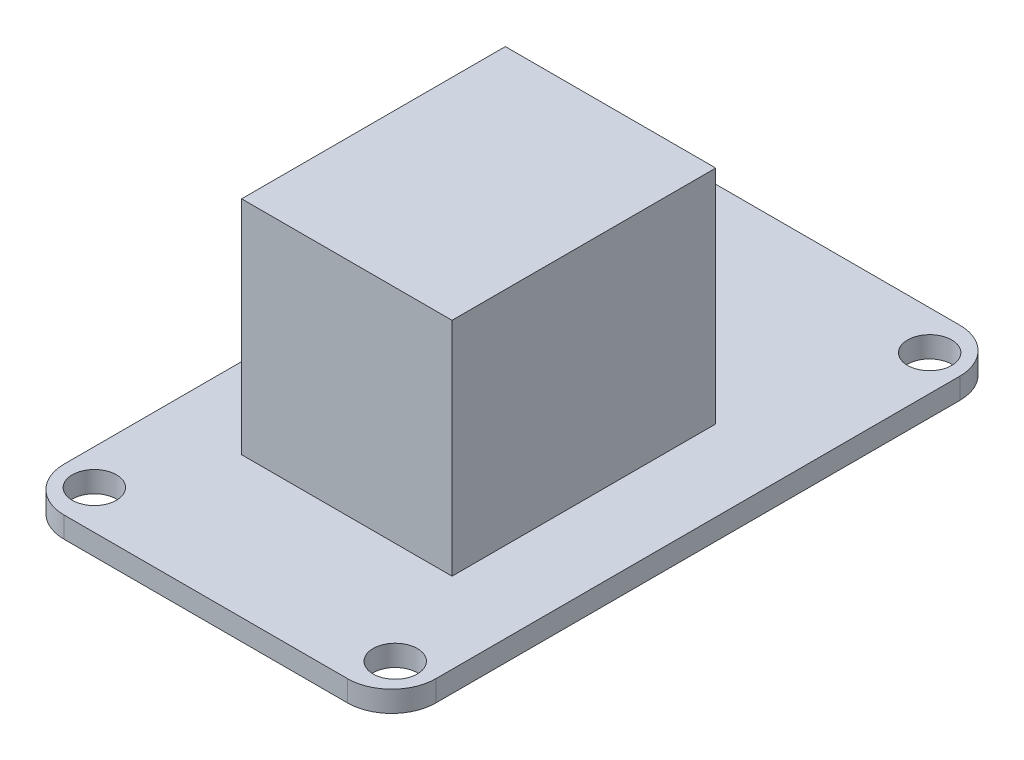
ISO-10303-21;
HEADER;
FILE_DESCRIPTION(('STEP AP214'),'2;1');
FILE_NAME('part.step','',(''),(''),'','','');
FILE_SCHEMA(('AUTOMOTIVE_DESIGN { 1 0 10303 214 1 1 1 1 }'));
ENDSEC;
DATA;
#1=APPLICATION_CONTEXT('core data for automotive mechanical design processes');
#2=APPLICATION_PROTOCOL_DEFINITION('international standard','automotive_design',2000,#1);
#3=PRODUCT_CONTEXT('',#1,'mechanical');
#4=PRODUCT('Part','Part','',(#3));
#5=PRODUCT_RELATED_PRODUCT_CATEGORY('part','',(#4));
#6=PRODUCT_DEFINITION_FORMATION('','',#4);
#7=PRODUCT_DEFINITION_CONTEXT('part definition',#1,'design');
#8=PRODUCT_DEFINITION('design','',#6,#7);
#9=PRODUCT_DEFINITION_SHAPE('','',#8);
#10=(LENGTH_UNIT() NAMED_UNIT(*) SI_UNIT(.MILLI.,.METRE.));
#11=(NAMED_UNIT(*) PLANE_ANGLE_UNIT() SI_UNIT($,.RADIAN.));
#12=(NAMED_UNIT(*) SI_UNIT($,.STERADIAN.) SOLID_ANGLE_UNIT());
#13=UNCERTAINTY_MEASURE_WITH_UNIT(LENGTH_MEASURE(1.E-05),#10,'distance_accuracy_value','');
#14=(GEOMETRIC_REPRESENTATION_CONTEXT(3) GLOBAL_UNCERTAINTY_ASSIGNED_CONTEXT((#13)) GLOBAL_UNIT_ASSIGNED_CONTEXT((#10,
#11,#12)) REPRESENTATION_CONTEXT('',''));
#15=CARTESIAN_POINT('',(0.,0.,0.));
#16=DIRECTION('',(0.,0.,1.));
#17=DIRECTION('',(1.,0.,0.));
#18=AXIS2_PLACEMENT_3D('',#15,#16,#17);
#19=CARTESIAN_POINT('',(0.,1.5,0.));
#20=DIRECTION('',(0.,-1.,0.));
#21=DIRECTION('',(0.,0.,-1.));
#22=AXIS2_PLACEMENT_3D('',#19,#20,#21);
#23=PLANE('',#22);
#24=DIRECTION('',(-1.,0.,0.));
#25=VECTOR('',#24,1.);
#26=CARTESIAN_POINT('',(13.25,1.5,-21.825));
#27=LINE('',#26,#25);
#28=CARTESIAN_POINT('',(10.1,1.5,-21.825));
#29=VERTEX_POINT('',#28);
#30=CARTESIAN_POINT('',(-10.1,1.5,-21.825));
#31=VERTEX_POINT('',#30);
#32=EDGE_CURVE('E210',#29,#31,#27,.T.);
#33=ORIENTED_EDGE('',*,*,#32,.T.);
#34=CARTESIAN_POINT('',(-10.1,1.5,-18.675));
#35=DIRECTION('',(0.,-1.,0.));
#36=DIRECTION('',(0.,0.,-1.));
#37=AXIS2_PLACEMENT_3D('',#34,#35,#36);
#38=CIRCLE('',#37,3.15);
#39=CARTESIAN_POINT('',(-13.25,1.5,-18.675));
#40=VERTEX_POINT('',#39);
#41=EDGE_CURVE('E263',#31,#40,#38,.F.);
#42=ORIENTED_EDGE('',*,*,#41,.T.);
#43=DIRECTION('',(0.,0.,1.));
#44=VECTOR('',#43,1.);
#45=CARTESIAN_POINT('',(-13.25,1.5,-21.825));
#46=LINE('',#45,#44);
#47=CARTESIAN_POINT('',(-13.25,1.5,18.675));
#48=VERTEX_POINT('',#47);
#49=EDGE_CURVE('E197',#40,#48,#46,.T.);
#50=ORIENTED_EDGE('',*,*,#49,.T.);
#51=CARTESIAN_POINT('',(-10.1,1.5,18.675));
#52=DIRECTION('',(0.,-1.,0.));
#53=DIRECTION('',(0.,0.,-1.));
#54=AXIS2_PLACEMENT_3D('',#51,#52,#53);
#55=CIRCLE('',#54,3.15);
#56=CARTESIAN_POINT('',(-10.1,1.5,21.825));
#57=VERTEX_POINT('',#56);
#58=EDGE_CURVE('E254',#48,#57,#55,.F.);
#59=ORIENTED_EDGE('',*,*,#58,.T.);
#60=DIRECTION('',(1.,0.,0.));
#61=VECTOR('',#60,1.);
#62=CARTESIAN_POINT('',(13.25,1.5,21.825));
#63=LINE('',#62,#61);
#64=CARTESIAN_POINT('',(10.1,1.5,21.825));
#65=VERTEX_POINT('',#64);
#66=EDGE_CURVE('E201',#57,#65,#63,.T.);
#67=ORIENTED_EDGE('',*,*,#66,.T.);
#68=CARTESIAN_POINT('',(10.1,1.5,18.675));
#69=DIRECTION('',(0.,-1.,0.));
#70=DIRECTION('',(0.,0.,-1.));
#71=AXIS2_PLACEMENT_3D('',#68,#69,#70);
#72=CIRCLE('',#71,3.15);
#73=CARTESIAN_POINT('',(13.25,1.5,18.675));
#74=VERTEX_POINT('',#73);
#75=EDGE_CURVE('E257',#65,#74,#72,.F.);
#76=ORIENTED_EDGE('',*,*,#75,.T.);
#77=DIRECTION('',(0.,0.,-1.));
#78=VECTOR('',#77,1.);
#79=CARTESIAN_POINT('',(13.25,1.5,-21.825));
#80=LINE('',#79,#78);
#81=CARTESIAN_POINT('',(13.25,1.5,-18.675));
#82=VERTEX_POINT('',#81);
#83=EDGE_CURVE('E206',#74,#82,#80,.T.);
#84=ORIENTED_EDGE('',*,*,#83,.T.);
#85=CARTESIAN_POINT('',(10.1,1.5,-18.675));
#86=DIRECTION('',(0.,-1.,0.));
#87=DIRECTION('',(0.,0.,-1.));
#88=AXIS2_PLACEMENT_3D('',#85,#86,#87);
#89=CIRCLE('',#88,3.15);
#90=EDGE_CURVE('E260',#82,#29,#89,.F.);
#91=ORIENTED_EDGE('',*,*,#90,.T.);
#92=EDGE_LOOP('',(#33,#42,#50,#59,#67,#76,#84,#91));
#93=FACE_BOUND('',#92,.T.);
#94=CARTESIAN_POINT('',(-10.725,1.5,-19.05));
#95=DIRECTION('',(0.,1.,0.));
#96=DIRECTION('',(0.,0.,1.));
#97=AXIS2_PLACEMENT_3D('',#94,#95,#96);
#98=CIRCLE('',#97,1.575);
#99=CARTESIAN_POINT('',(-10.725,1.5,-17.475));
#100=VERTEX_POINT('',#99);
#101=EDGE_CURVE('E173',#100,#100,#98,.T.);
#102=ORIENTED_EDGE('',*,*,#101,.F.);
#103=EDGE_LOOP('',(#102));
#104=FACE_BOUND('',#103,.T.);
#105=CARTESIAN_POINT('',(10.725,1.5,-19.05));
#106=DIRECTION('',(0.,1.,0.));
#107=DIRECTION('',(0.,0.,1.));
#108=AXIS2_PLACEMENT_3D('',#105,#106,#107);
#109=CIRCLE('',#108,1.575);
#110=CARTESIAN_POINT('',(10.725,1.5,-17.475));
#111=VERTEX_POINT('',#110);
#112=EDGE_CURVE('E169',#111,#111,#109,.T.);
#113=ORIENTED_EDGE('',*,*,#112,.F.);
#114=EDGE_LOOP('',(#113));
#115=FACE_BOUND('',#114,.T.);
#116=CARTESIAN_POINT('',(10.725,1.5,19.05));
#117=DIRECTION('',(0.,1.,0.));
#118=DIRECTION('',(0.,0.,1.));
#119=AXIS2_PLACEMENT_3D('',#116,#117,#118);
#120=CIRCLE('',#119,1.575);
#121=CARTESIAN_POINT('',(10.725,1.5,20.625));
#122=VERTEX_POINT('',#121);
#123=EDGE_CURVE('E178',#122,#122,#120,.T.);
#124=ORIENTED_EDGE('',*,*,#123,.F.);
#125=EDGE_LOOP('',(#124));
#126=FACE_BOUND('',#125,.T.);
#127=CARTESIAN_POINT('',(-10.725,1.5,19.05));
#128=DIRECTION('',(0.,1.,0.));
#129=DIRECTION('',(0.,0.,1.));
#130=AXIS2_PLACEMENT_3D('',#127,#128,#129);
#131=CIRCLE('',#130,1.575);
#132=CARTESIAN_POINT('',(-10.725,1.5,20.625));
#133=VERTEX_POINT('',#132);
#134=EDGE_CURVE('E163',#133,#133,#131,.T.);
#135=ORIENTED_EDGE('',*,*,#134,.F.);
#136=EDGE_LOOP('',(#135));
#137=FACE_BOUND('',#136,.T.);
#138=DIRECTION('',(0.,0.,1.));
#139=VECTOR('',#138,1.);
#140=CARTESIAN_POINT('',(-7.5,1.5,-7.025));
#141=LINE('',#140,#139);
#142=CARTESIAN_POINT('',(-7.5,1.5,-7.025));
#143=VERTEX_POINT('',#142);
#144=CARTESIAN_POINT('',(-7.5,1.5,11.775));
#145=VERTEX_POINT('',#144);
#146=EDGE_CURVE('E156',#143,#145,#141,.T.);
#147=ORIENTED_EDGE('',*,*,#146,.F.);
#148=DIRECTION('',(-1.,0.,0.));
#149=VECTOR('',#148,1.);
#150=CARTESIAN_POINT('',(7.5,1.5,-7.025));
#151=LINE('',#150,#149);
#152=CARTESIAN_POINT('',(7.5,1.5,-7.025));
#153=VERTEX_POINT('',#152);
#154=EDGE_CURVE('E153',#153,#143,#151,.T.);
#155=ORIENTED_EDGE('',*,*,#154,.F.);
#156=DIRECTION('',(0.,0.,-1.));
#157=VECTOR('',#156,1.);
#158=CARTESIAN_POINT('',(7.5,1.5,-7.025));
#159=LINE('',#158,#157);
#160=CARTESIAN_POINT('',(7.5,1.5,11.775));
#161=VERTEX_POINT('',#160);
#162=EDGE_CURVE('E66',#161,#153,#159,.T.);
#163=ORIENTED_EDGE('',*,*,#162,.F.);
#164=DIRECTION('',(1.,0.,0.));
#165=VECTOR('',#164,1.);
#166=CARTESIAN_POINT('',(7.5,1.5,11.775));
#167=LINE('',#166,#165);
#168=EDGE_CURVE('E61',#145,#161,#167,.T.);
#169=ORIENTED_EDGE('',*,*,#168,.F.);
#170=EDGE_LOOP('',(#147,#155,#163,#169));
#171=FACE_BOUND('',#170,.T.);
#172=ADVANCED_FACE('F45',(#93,#104,#115,#126,#137,#171),#23,.F.);
#173=CARTESIAN_POINT('',(-13.25,1.5,-21.825));
#174=DIRECTION('',(1.,0.,0.));
#175=DIRECTION('',(0.,0.,-1.));
#176=AXIS2_PLACEMENT_3D('',#173,#174,#175);
#177=PLANE('',#176);
#178=ORIENTED_EDGE('',*,*,#49,.F.);
#179=DIRECTION('',(0.,-1.,0.));
#180=VECTOR('',#179,1.);
#181=CARTESIAN_POINT('',(-13.25,1.5,-18.675));
#182=LINE('',#181,#180);
#183=CARTESIAN_POINT('',(-13.25,0.,-18.675));
#184=VERTEX_POINT('',#183);
#185=EDGE_CURVE('E231',#40,#184,#182,.T.);
#186=ORIENTED_EDGE('',*,*,#185,.T.);
#187=DIRECTION('',(0.,0.,1.));
#188=VECTOR('',#187,1.);
#189=CARTESIAN_POINT('',(-13.25,0.,-21.825));
#190=LINE('',#189,#188);
#191=CARTESIAN_POINT('',(-13.25,0.,18.675));
#192=VERTEX_POINT('',#191);
#193=EDGE_CURVE('E193',#184,#192,#190,.T.);
#194=ORIENTED_EDGE('',*,*,#193,.T.);
#195=DIRECTION('',(0.,-1.,0.));
#196=VECTOR('',#195,1.);
#197=CARTESIAN_POINT('',(-13.25,1.5,18.675));
#198=LINE('',#197,#196);
#199=EDGE_CURVE('E214',#192,#48,#198,.F.);
#200=ORIENTED_EDGE('',*,*,#199,.T.);
#201=EDGE_LOOP('',(#178,#186,#194,#200));
#202=FACE_BOUND('',#201,.T.);
#203=ADVANCED_FACE('F311',(#202),#177,.F.);
#204=CARTESIAN_POINT('',(13.25,1.5,21.825));
#205=DIRECTION('',(0.,0.,-1.));
#206=DIRECTION('',(-1.,0.,0.));
#207=AXIS2_PLACEMENT_3D('',#204,#205,#206);
#208=PLANE('',#207);
#209=DIRECTION('',(1.,0.,0.));
#210=VECTOR('',#209,1.);
#211=CARTESIAN_POINT('',(13.25,0.,21.825));
#212=LINE('',#211,#210);
#213=CARTESIAN_POINT('',(-10.1,0.,21.825));
#214=VERTEX_POINT('',#213);
#215=CARTESIAN_POINT('',(10.1,0.,21.825));
#216=VERTEX_POINT('',#215);
#217=EDGE_CURVE('E218',#214,#216,#212,.T.);
#218=ORIENTED_EDGE('',*,*,#217,.T.);
#219=DIRECTION('',(0.,-1.,0.));
#220=VECTOR('',#219,1.);
#221=CARTESIAN_POINT('',(10.1,1.5,21.825));
#222=LINE('',#221,#220);
#223=EDGE_CURVE('E11',#216,#65,#222,.F.);
#224=ORIENTED_EDGE('',*,*,#223,.T.);
#225=ORIENTED_EDGE('',*,*,#66,.F.);
#226=DIRECTION('',(0.,-1.,0.));
#227=VECTOR('',#226,1.);
#228=CARTESIAN_POINT('',(-10.1,1.5,21.825));
#229=LINE('',#228,#227);
#230=EDGE_CURVE('E54',#57,#214,#229,.T.);
#231=ORIENTED_EDGE('',*,*,#230,.T.);
#232=EDGE_LOOP('',(#218,#224,#225,#231));
#233=FACE_BOUND('',#232,.T.);
#234=ADVANCED_FACE('F278',(#233),#208,.F.);
#235=CARTESIAN_POINT('',(13.25,1.5,-21.825));
#236=DIRECTION('',(-1.,0.,0.));
#237=DIRECTION('',(0.,0.,1.));
#238=AXIS2_PLACEMENT_3D('',#235,#236,#237);
#239=PLANE('',#238);
#240=DIRECTION('',(0.,0.,-1.));
#241=VECTOR('',#240,1.);
#242=CARTESIAN_POINT('',(13.25,0.,-21.825));
#243=LINE('',#242,#241);
#244=CARTESIAN_POINT('',(13.25,0.,18.675));
#245=VERTEX_POINT('',#244);
#246=CARTESIAN_POINT('',(13.25,0.,-18.675));
#247=VERTEX_POINT('',#246);
#248=EDGE_CURVE('E222',#245,#247,#243,.T.);
#249=ORIENTED_EDGE('',*,*,#248,.T.);
#250=DIRECTION('',(0.,-1.,0.));
#251=VECTOR('',#250,1.);
#252=CARTESIAN_POINT('',(13.25,1.5,-18.675));
#253=LINE('',#252,#251);
#254=EDGE_CURVE('E270',#247,#82,#253,.F.);
#255=ORIENTED_EDGE('',*,*,#254,.T.);
#256=ORIENTED_EDGE('',*,*,#83,.F.);
#257=DIRECTION('',(0.,-1.,0.));
#258=VECTOR('',#257,1.);
#259=CARTESIAN_POINT('',(13.25,1.5,18.675));
#260=LINE('',#259,#258);
#261=EDGE_CURVE('E266',#74,#245,#260,.T.);
#262=ORIENTED_EDGE('',*,*,#261,.T.);
#263=EDGE_LOOP('',(#249,#255,#256,#262));
#264=FACE_BOUND('',#263,.T.);
#265=ADVANCED_FACE('F292',(#264),#239,.F.);
#266=CARTESIAN_POINT('',(13.25,1.5,-21.825));
#267=DIRECTION('',(0.,0.,1.));
#268=DIRECTION('',(1.,0.,0.));
#269=AXIS2_PLACEMENT_3D('',#266,#267,#268);
#270=PLANE('',#269);
#271=DIRECTION('',(-1.,0.,0.));
#272=VECTOR('',#271,1.);
#273=CARTESIAN_POINT('',(13.25,0.,-21.825));
#274=LINE('',#273,#272);
#275=CARTESIAN_POINT('',(10.1,0.,-21.825));
#276=VERTEX_POINT('',#275);
#277=CARTESIAN_POINT('',(-10.1,0.,-21.825));
#278=VERTEX_POINT('',#277);
#279=EDGE_CURVE('E202',#276,#278,#274,.T.);
#280=ORIENTED_EDGE('',*,*,#279,.T.);
#281=DIRECTION('',(0.,-1.,0.));
#282=VECTOR('',#281,1.);
#283=CARTESIAN_POINT('',(-10.1,1.5,-21.825));
#284=LINE('',#283,#282);
#285=EDGE_CURVE('E251',#278,#31,#284,.F.);
#286=ORIENTED_EDGE('',*,*,#285,.T.);
#287=ORIENTED_EDGE('',*,*,#32,.F.);
#288=DIRECTION('',(0.,-1.,0.));
#289=VECTOR('',#288,1.);
#290=CARTESIAN_POINT('',(10.1,1.5,-21.825));
#291=LINE('',#290,#289);
#292=EDGE_CURVE('E247',#29,#276,#291,.T.);
#293=ORIENTED_EDGE('',*,*,#292,.T.);
#294=EDGE_LOOP('',(#280,#286,#287,#293));
#295=FACE_BOUND('',#294,.T.);
#296=ADVANCED_FACE('F303',(#295),#270,.F.);
#297=CARTESIAN_POINT('',(0.,0.,0.));
#298=DIRECTION('',(0.,-1.,0.));
#299=DIRECTION('',(0.,0.,-1.));
#300=AXIS2_PLACEMENT_3D('',#297,#298,#299);
#301=PLANE('',#300);
#302=CARTESIAN_POINT('',(-10.725,0.,19.05));
#303=DIRECTION('',(0.,1.,0.));
#304=DIRECTION('',(0.,0.,1.));
#305=AXIS2_PLACEMENT_3D('',#302,#303,#304);
#306=CIRCLE('',#305,1.575);
#307=CARTESIAN_POINT('',(-10.725,0.,20.625));
#308=VERTEX_POINT('',#307);
#309=EDGE_CURVE('E158',#308,#308,#306,.T.);
#310=ORIENTED_EDGE('',*,*,#309,.T.);
#311=EDGE_LOOP('',(#310));
#312=FACE_BOUND('',#311,.T.);
#313=CARTESIAN_POINT('',(10.725,0.,19.05));
#314=DIRECTION('',(0.,1.,0.));
#315=DIRECTION('',(0.,0.,1.));
#316=AXIS2_PLACEMENT_3D('',#313,#314,#315);
#317=CIRCLE('',#316,1.575);
#318=CARTESIAN_POINT('',(10.725,0.,20.625));
#319=VERTEX_POINT('',#318);
#320=EDGE_CURVE('E182',#319,#319,#317,.T.);
#321=ORIENTED_EDGE('',*,*,#320,.T.);
#322=EDGE_LOOP('',(#321));
#323=FACE_BOUND('',#322,.T.);
#324=CARTESIAN_POINT('',(10.725,0.,-19.05));
#325=DIRECTION('',(0.,1.,0.));
#326=DIRECTION('',(0.,0.,1.));
#327=AXIS2_PLACEMENT_3D('',#324,#325,#326);
#328=CIRCLE('',#327,1.575);
#329=CARTESIAN_POINT('',(10.725,0.,-17.475));
#330=VERTEX_POINT('',#329);
#331=EDGE_CURVE('E174',#330,#330,#328,.T.);
#332=ORIENTED_EDGE('',*,*,#331,.T.);
#333=EDGE_LOOP('',(#332));
#334=FACE_BOUND('',#333,.T.);
#335=CARTESIAN_POINT('',(-10.725,0.,-19.05));
#336=DIRECTION('',(0.,1.,0.));
#337=DIRECTION('',(0.,0.,1.));
#338=AXIS2_PLACEMENT_3D('',#335,#336,#337);
#339=CIRCLE('',#338,1.575);
#340=CARTESIAN_POINT('',(-10.725,0.,-17.475));
#341=VERTEX_POINT('',#340);
#342=EDGE_CURVE('E189',#341,#341,#339,.T.);
#343=ORIENTED_EDGE('',*,*,#342,.T.);
#344=EDGE_LOOP('',(#343));
#345=FACE_BOUND('',#344,.T.);
#346=ORIENTED_EDGE('',*,*,#193,.F.);
#347=CARTESIAN_POINT('',(-10.1,0.,-18.675));
#348=DIRECTION('',(0.,-1.,0.));
#349=DIRECTION('',(0.,0.,-1.));
#350=AXIS2_PLACEMENT_3D('',#347,#348,#349);
#351=CIRCLE('',#350,3.15);
#352=EDGE_CURVE('E244',#184,#278,#351,.T.);
#353=ORIENTED_EDGE('',*,*,#352,.T.);
#354=ORIENTED_EDGE('',*,*,#279,.F.);
#355=CARTESIAN_POINT('',(10.1,0.,-18.675));
#356=DIRECTION('',(0.,-1.,0.));
#357=DIRECTION('',(0.,0.,-1.));
#358=AXIS2_PLACEMENT_3D('',#355,#356,#357);
#359=CIRCLE('',#358,3.15);
#360=EDGE_CURVE('E241',#276,#247,#359,.T.);
#361=ORIENTED_EDGE('',*,*,#360,.T.);
#362=ORIENTED_EDGE('',*,*,#248,.F.);
#363=CARTESIAN_POINT('',(10.1,0.,18.675));
#364=DIRECTION('',(0.,-1.,0.));
#365=DIRECTION('',(0.,0.,-1.));
#366=AXIS2_PLACEMENT_3D('',#363,#364,#365);
#367=CIRCLE('',#366,3.15);
#368=EDGE_CURVE('E238',#245,#216,#367,.T.);
#369=ORIENTED_EDGE('',*,*,#368,.T.);
#370=ORIENTED_EDGE('',*,*,#217,.F.);
#371=CARTESIAN_POINT('',(-10.1,0.,18.675));
#372=DIRECTION('',(0.,-1.,0.));
#373=DIRECTION('',(0.,0.,-1.));
#374=AXIS2_PLACEMENT_3D('',#371,#372,#373);
#375=CIRCLE('',#374,3.15);
#376=EDGE_CURVE('E235',#214,#192,#375,.T.);
#377=ORIENTED_EDGE('',*,*,#376,.T.);
#378=EDGE_LOOP('',(#346,#353,#354,#361,#362,#369,#370,#377));
#379=FACE_BOUND('',#378,.T.);
#380=ADVANCED_FACE('F284',(#312,#323,#334,#345,#379),#301,.T.);
#381=CARTESIAN_POINT('',(-10.1,1.5,-18.675));
#382=DIRECTION('',(0.,-1.,0.));
#383=DIRECTION('',(0.,0.,-1.));
#384=AXIS2_PLACEMENT_3D('',#381,#382,#383);
#385=CYLINDRICAL_SURFACE('',#384,3.15);
#386=ORIENTED_EDGE('',*,*,#41,.F.);
#387=ORIENTED_EDGE('',*,*,#285,.F.);
#388=ORIENTED_EDGE('',*,*,#352,.F.);
#389=ORIENTED_EDGE('',*,*,#185,.F.);
#390=EDGE_LOOP('',(#386,#387,#388,#389));
#391=FACE_BOUND('',#390,.T.);
#392=ADVANCED_FACE('F308',(#391),#385,.T.);
#393=CARTESIAN_POINT('',(10.1,1.5,-18.675));
#394=DIRECTION('',(0.,-1.,0.));
#395=DIRECTION('',(0.,0.,-1.));
#396=AXIS2_PLACEMENT_3D('',#393,#394,#395);
#397=CYLINDRICAL_SURFACE('',#396,3.15);
#398=ORIENTED_EDGE('',*,*,#90,.F.);
#399=ORIENTED_EDGE('',*,*,#254,.F.);
#400=ORIENTED_EDGE('',*,*,#360,.F.);
#401=ORIENTED_EDGE('',*,*,#292,.F.);
#402=EDGE_LOOP('',(#398,#399,#400,#401));
#403=FACE_BOUND('',#402,.T.);
#404=ADVANCED_FACE('F300',(#403),#397,.T.);
#405=CARTESIAN_POINT('',(10.1,1.5,18.675));
#406=DIRECTION('',(0.,-1.,0.));
#407=DIRECTION('',(0.,0.,-1.));
#408=AXIS2_PLACEMENT_3D('',#405,#406,#407);
#409=CYLINDRICAL_SURFACE('',#408,3.15);
#410=ORIENTED_EDGE('',*,*,#75,.F.);
#411=ORIENTED_EDGE('',*,*,#223,.F.);
#412=ORIENTED_EDGE('',*,*,#368,.F.);
#413=ORIENTED_EDGE('',*,*,#261,.F.);
#414=EDGE_LOOP('',(#410,#411,#412,#413));
#415=FACE_BOUND('',#414,.T.);
#416=ADVANCED_FACE('F289',(#415),#409,.T.);
#417=CARTESIAN_POINT('',(-10.1,1.5,18.675));
#418=DIRECTION('',(0.,-1.,0.));
#419=DIRECTION('',(0.,0.,-1.));
#420=AXIS2_PLACEMENT_3D('',#417,#418,#419);
#421=CYLINDRICAL_SURFACE('',#420,3.15);
#422=ORIENTED_EDGE('',*,*,#58,.F.);
#423=ORIENTED_EDGE('',*,*,#199,.F.);
#424=ORIENTED_EDGE('',*,*,#376,.F.);
#425=ORIENTED_EDGE('',*,*,#230,.F.);
#426=EDGE_LOOP('',(#422,#423,#424,#425));
#427=FACE_BOUND('',#426,.T.);
#428=ADVANCED_FACE('F47',(#427),#421,.T.);
#429=CARTESIAN_POINT('',(-10.725,0.,-19.05));
#430=DIRECTION('',(0.,1.,0.));
#431=DIRECTION('',(0.,0.,1.));
#432=AXIS2_PLACEMENT_3D('',#429,#430,#431);
#433=CYLINDRICAL_SURFACE('',#432,1.575);
#434=ORIENTED_EDGE('',*,*,#342,.F.);
#435=EDGE_LOOP('',(#434));
#436=FACE_BOUND('',#435,.T.);
#437=ORIENTED_EDGE('',*,*,#101,.T.);
#438=EDGE_LOOP('',(#437));
#439=FACE_BOUND('',#438,.T.);
#440=ADVANCED_FACE('F314',(#436,#439),#433,.F.);
#441=CARTESIAN_POINT('',(10.725,0.,-19.05));
#442=DIRECTION('',(0.,1.,0.));
#443=DIRECTION('',(0.,0.,1.));
#444=AXIS2_PLACEMENT_3D('',#441,#442,#443);
#445=CYLINDRICAL_SURFACE('',#444,1.575);
#446=ORIENTED_EDGE('',*,*,#331,.F.);
#447=EDGE_LOOP('',(#446));
#448=FACE_BOUND('',#447,.T.);
#449=ORIENTED_EDGE('',*,*,#112,.T.);
#450=EDGE_LOOP('',(#449));
#451=FACE_BOUND('',#450,.T.);
#452=ADVANCED_FACE('F319',(#448,#451),#445,.F.);
#453=CARTESIAN_POINT('',(10.725,0.,19.05));
#454=DIRECTION('',(0.,1.,0.));
#455=DIRECTION('',(0.,0.,1.));
#456=AXIS2_PLACEMENT_3D('',#453,#454,#455);
#457=CYLINDRICAL_SURFACE('',#456,1.575);
#458=ORIENTED_EDGE('',*,*,#320,.F.);
#459=EDGE_LOOP('',(#458));
#460=FACE_BOUND('',#459,.T.);
#461=ORIENTED_EDGE('',*,*,#123,.T.);
#462=EDGE_LOOP('',(#461));
#463=FACE_BOUND('',#462,.T.);
#464=ADVANCED_FACE('F385',(#460,#463),#457,.F.);
#465=CARTESIAN_POINT('',(-10.725,0.,19.05));
#466=DIRECTION('',(0.,1.,0.));
#467=DIRECTION('',(0.,0.,1.));
#468=AXIS2_PLACEMENT_3D('',#465,#466,#467);
#469=CYLINDRICAL_SURFACE('',#468,1.575);
#470=ORIENTED_EDGE('',*,*,#309,.F.);
#471=EDGE_LOOP('',(#470));
#472=FACE_BOUND('',#471,.T.);
#473=ORIENTED_EDGE('',*,*,#134,.T.);
#474=EDGE_LOOP('',(#473));
#475=FACE_BOUND('',#474,.T.);
#476=ADVANCED_FACE('F396',(#472,#475),#469,.F.);
#477=CARTESIAN_POINT('',(-7.5,17.3,-7.025));
#478=DIRECTION('',(1.,0.,0.));
#479=DIRECTION('',(0.,0.,-1.));
#480=AXIS2_PLACEMENT_3D('',#477,#478,#479);
#481=PLANE('',#480);
#482=ORIENTED_EDGE('',*,*,#146,.T.);
#483=DIRECTION('',(0.,-1.,0.));
#484=VECTOR('',#483,1.);
#485=CARTESIAN_POINT('',(-7.5,17.3,11.775));
#486=LINE('',#485,#484);
#487=CARTESIAN_POINT('',(-7.5,17.3,11.775));
#488=VERTEX_POINT('',#487);
#489=EDGE_CURVE('E135',#488,#145,#486,.T.);
#490=ORIENTED_EDGE('',*,*,#489,.F.);
#491=DIRECTION('',(0.,0.,1.));
#492=VECTOR('',#491,1.);
#493=CARTESIAN_POINT('',(-7.5,17.3,-7.025));
#494=LINE('',#493,#492);
#495=CARTESIAN_POINT('',(-7.5,17.3,-7.025));
#496=VERTEX_POINT('',#495);
#497=EDGE_CURVE('E143',#496,#488,#494,.T.);
#498=ORIENTED_EDGE('',*,*,#497,.F.);
#499=DIRECTION('',(0.,-1.,0.));
#500=VECTOR('',#499,1.);
#501=CARTESIAN_POINT('',(-7.5,17.3,-7.025));
#502=LINE('',#501,#500);
#503=EDGE_CURVE('E484',#496,#143,#502,.T.);
#504=ORIENTED_EDGE('',*,*,#503,.T.);
#505=EDGE_LOOP('',(#482,#490,#498,#504));
#506=FACE_BOUND('',#505,.T.);
#507=ADVANCED_FACE('F155',(#506),#481,.F.);
#508=CARTESIAN_POINT('',(7.5,17.3,11.775));
#509=DIRECTION('',(0.,0.,-1.));
#510=DIRECTION('',(-1.,0.,0.));
#511=AXIS2_PLACEMENT_3D('',#508,#509,#510);
#512=PLANE('',#511);
#513=ORIENTED_EDGE('',*,*,#168,.T.);
#514=DIRECTION('',(0.,-1.,0.));
#515=VECTOR('',#514,1.);
#516=CARTESIAN_POINT('',(7.5,17.3,11.775));
#517=LINE('',#516,#515);
#518=CARTESIAN_POINT('',(7.5,17.3,11.775));
#519=VERTEX_POINT('',#518);
#520=EDGE_CURVE('E138',#519,#161,#517,.T.);
#521=ORIENTED_EDGE('',*,*,#520,.F.);
#522=DIRECTION('',(1.,0.,0.));
#523=VECTOR('',#522,1.);
#524=CARTESIAN_POINT('',(7.5,17.3,11.775));
#525=LINE('',#524,#523);
#526=EDGE_CURVE('E131',#488,#519,#525,.T.);
#527=ORIENTED_EDGE('',*,*,#526,.F.);
#528=ORIENTED_EDGE('',*,*,#489,.T.);
#529=EDGE_LOOP('',(#513,#521,#527,#528));
#530=FACE_BOUND('',#529,.T.);
#531=ADVANCED_FACE('F133',(#530),#512,.F.);
#532=CARTESIAN_POINT('',(7.5,17.3,-7.025));
#533=DIRECTION('',(-1.,0.,0.));
#534=DIRECTION('',(0.,0.,1.));
#535=AXIS2_PLACEMENT_3D('',#532,#533,#534);
#536=PLANE('',#535);
#537=ORIENTED_EDGE('',*,*,#162,.T.);
#538=DIRECTION('',(0.,-1.,0.));
#539=VECTOR('',#538,1.);
#540=CARTESIAN_POINT('',(7.5,17.3,-7.025));
#541=LINE('',#540,#539);
#542=CARTESIAN_POINT('',(7.5,17.3,-7.025));
#543=VERTEX_POINT('',#542);
#544=EDGE_CURVE('E165',#543,#153,#541,.T.);
#545=ORIENTED_EDGE('',*,*,#544,.F.);
#546=DIRECTION('',(0.,0.,-1.));
#547=VECTOR('',#546,1.);
#548=CARTESIAN_POINT('',(7.5,17.3,-7.025));
#549=LINE('',#548,#547);
#550=EDGE_CURVE('E142',#519,#543,#549,.T.);
#551=ORIENTED_EDGE('',*,*,#550,.F.);
#552=ORIENTED_EDGE('',*,*,#520,.T.);
#553=EDGE_LOOP('',(#537,#545,#551,#552));
#554=FACE_BOUND('',#553,.T.);
#555=ADVANCED_FACE('F436',(#554),#536,.F.);
#556=CARTESIAN_POINT('',(7.5,17.3,-7.025));
#557=DIRECTION('',(0.,0.,1.));
#558=DIRECTION('',(1.,0.,0.));
#559=AXIS2_PLACEMENT_3D('',#556,#557,#558);
#560=PLANE('',#559);
#561=ORIENTED_EDGE('',*,*,#154,.T.);
#562=ORIENTED_EDGE('',*,*,#503,.F.);
#563=DIRECTION('',(-1.,0.,0.));
#564=VECTOR('',#563,1.);
#565=CARTESIAN_POINT('',(7.5,17.3,-7.025));
#566=LINE('',#565,#564);
#567=EDGE_CURVE('E148',#543,#496,#566,.T.);
#568=ORIENTED_EDGE('',*,*,#567,.F.);
#569=ORIENTED_EDGE('',*,*,#544,.T.);
#570=EDGE_LOOP('',(#561,#562,#568,#569));
#571=FACE_BOUND('',#570,.T.);
#572=ADVANCED_FACE('F447',(#571),#560,.F.);
#573=CARTESIAN_POINT('',(0.,17.3,0.));
#574=DIRECTION('',(0.,-1.,0.));
#575=DIRECTION('',(0.,0.,-1.));
#576=AXIS2_PLACEMENT_3D('',#573,#574,#575);
#577=PLANE('',#576);
#578=ORIENTED_EDGE('',*,*,#497,.T.);
#579=ORIENTED_EDGE('',*,*,#526,.T.);
#580=ORIENTED_EDGE('',*,*,#550,.T.);
#581=ORIENTED_EDGE('',*,*,#567,.T.);
#582=EDGE_LOOP('',(#578,#579,#580,#581));
#583=FACE_BOUND('',#582,.T.);
#584=ADVANCED_FACE('F146',(#583),#577,.F.);
#585=CLOSED_SHELL('',(#172,#203,#234,#265,#296,#380,#392,#404,#416,#428,#440,#452,#464,#476,
#507,#531,#555,#572,#584));
#586=MANIFOLD_SOLID_BREP('B2',#585);
#587=ADVANCED_BREP_SHAPE_REPRESENTATION('',(#18,#586),#14);
#588=SHAPE_DEFINITION_REPRESENTATION(#9,#587);
ENDSEC;
END-ISO-10303-21;
